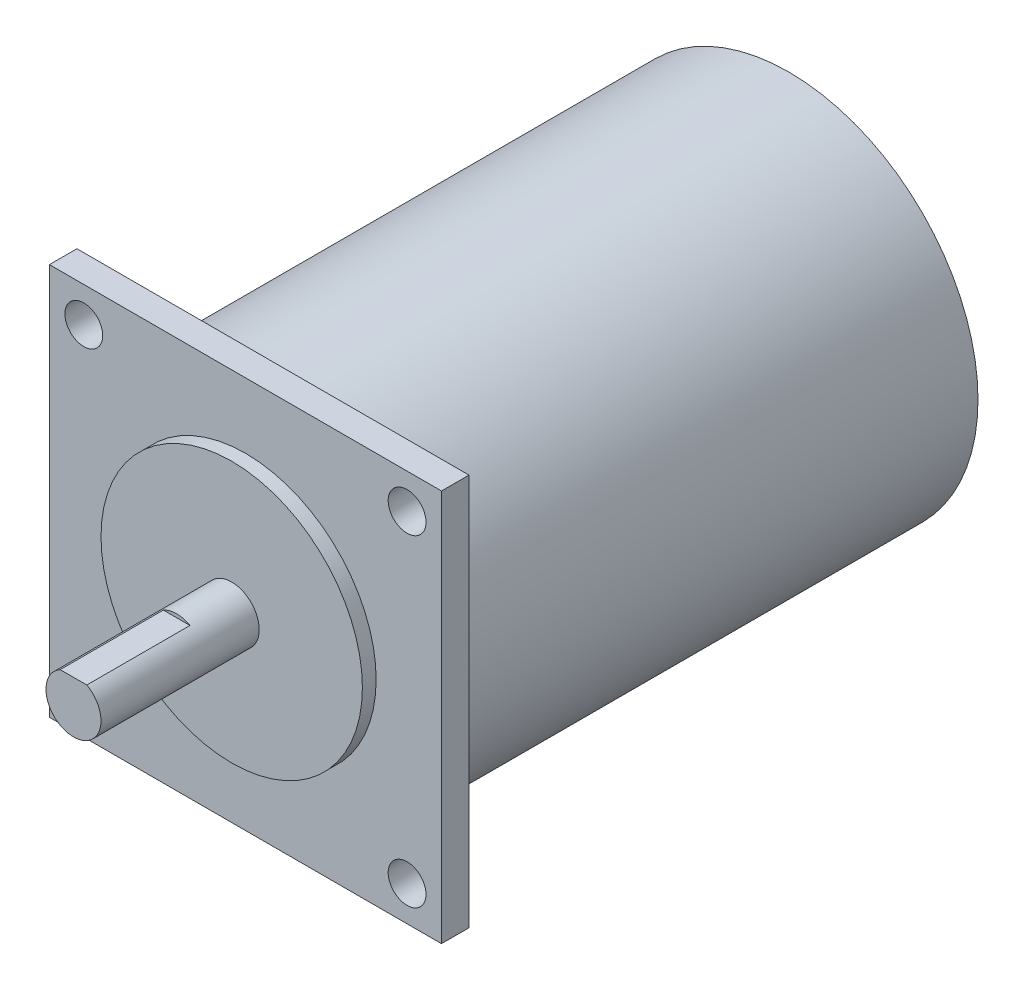
ISO-10303-21;
HEADER;
FILE_DESCRIPTION(('STEP AP214'),'2;1');
FILE_NAME('part.step','',(''),(''),'','','');
FILE_SCHEMA(('AUTOMOTIVE_DESIGN { 1 0 10303 214 1 1 1 1 }'));
ENDSEC;
DATA;
#1=APPLICATION_CONTEXT('core data for automotive mechanical design processes');
#2=APPLICATION_PROTOCOL_DEFINITION('international standard','automotive_design',2000,#1);
#3=PRODUCT_CONTEXT('',#1,'mechanical');
#4=PRODUCT('Part','Part','',(#3));
#5=PRODUCT_RELATED_PRODUCT_CATEGORY('part','',(#4));
#6=PRODUCT_DEFINITION_FORMATION('','',#4);
#7=PRODUCT_DEFINITION_CONTEXT('part definition',#1,'design');
#8=PRODUCT_DEFINITION('design','',#6,#7);
#9=PRODUCT_DEFINITION_SHAPE('','',#8);
#10=(LENGTH_UNIT() NAMED_UNIT(*) SI_UNIT(.MILLI.,.METRE.));
#11=(NAMED_UNIT(*) PLANE_ANGLE_UNIT() SI_UNIT($,.RADIAN.));
#12=(NAMED_UNIT(*) SI_UNIT($,.STERADIAN.) SOLID_ANGLE_UNIT());
#13=UNCERTAINTY_MEASURE_WITH_UNIT(LENGTH_MEASURE(1.E-05),#10,'distance_accuracy_value','');
#14=(GEOMETRIC_REPRESENTATION_CONTEXT(3) GLOBAL_UNCERTAINTY_ASSIGNED_CONTEXT((#13)) GLOBAL_UNIT_ASSIGNED_CONTEXT((#10,
#11,#12)) REPRESENTATION_CONTEXT('',''));
#15=CARTESIAN_POINT('',(0.,0.,0.));
#16=DIRECTION('',(0.,0.,1.));
#17=DIRECTION('',(1.,0.,0.));
#18=AXIS2_PLACEMENT_3D('',#15,#16,#17);
#19=CARTESIAN_POINT('',(0.,0.,4.));
#20=DIRECTION('',(0.,0.,1.));
#21=DIRECTION('',(1.,0.,0.));
#22=AXIS2_PLACEMENT_3D('',#19,#20,#21);
#23=PLANE('',#22);
#24=CARTESIAN_POINT('',(-6.1868327402135,8.31672597864768,4.));
#25=DIRECTION('',(0.,0.,1.));
#26=DIRECTION('',(1.,0.,0.));
#27=AXIS2_PLACEMENT_3D('',#24,#25,#26);
#28=CIRCLE('',#27,19.);
#29=CARTESIAN_POINT('',(12.8131672597865,8.31672597864768,4.));
#30=VERTEX_POINT('',#29);
#31=EDGE_CURVE('E111',#30,#30,#28,.T.);
#32=ORIENTED_EDGE('',*,*,#31,.F.);
#33=EDGE_LOOP('',(#32));
#34=FACE_BOUND('',#33,.T.);
#35=CARTESIAN_POINT('',(17.3131672597865,-15.1120996441281,4.));
#36=DIRECTION('',(0.,0.,1.));
#37=DIRECTION('',(1.,0.,0.));
#38=AXIS2_PLACEMENT_3D('',#35,#36,#37);
#39=CIRCLE('',#38,2.75);
#40=CARTESIAN_POINT('',(20.0631672597865,-15.1120996441281,4.));
#41=VERTEX_POINT('',#40);
#42=EDGE_CURVE('E133',#41,#41,#39,.T.);
#43=ORIENTED_EDGE('',*,*,#42,.F.);
#44=EDGE_LOOP('',(#43));
#45=FACE_BOUND('',#44,.T.);
#46=CARTESIAN_POINT('',(-29.6868327402135,31.7455516014235,4.));
#47=DIRECTION('',(0.,0.,1.));
#48=DIRECTION('',(1.,0.,0.));
#49=AXIS2_PLACEMENT_3D('',#46,#47,#48);
#50=CIRCLE('',#49,2.75);
#51=CARTESIAN_POINT('',(-26.9368327402135,31.7455516014235,4.));
#52=VERTEX_POINT('',#51);
#53=EDGE_CURVE('E145',#52,#52,#50,.T.);
#54=ORIENTED_EDGE('',*,*,#53,.F.);
#55=EDGE_LOOP('',(#54));
#56=FACE_BOUND('',#55,.T.);
#57=DIRECTION('',(0.,-1.,0.));
#58=VECTOR('',#57,1.);
#59=CARTESIAN_POINT('',(-34.6868327402135,36.8167259786477,4.));
#60=LINE('',#59,#58);
#61=CARTESIAN_POINT('',(-34.6868327402135,36.8167259786477,4.));
#62=VERTEX_POINT('',#61);
#63=CARTESIAN_POINT('',(-34.6868327402135,-20.1832740213523,4.));
#64=VERTEX_POINT('',#63);
#65=EDGE_CURVE('E151',#62,#64,#60,.T.);
#66=ORIENTED_EDGE('',*,*,#65,.T.);
#67=DIRECTION('',(1.,0.,0.));
#68=VECTOR('',#67,1.);
#69=CARTESIAN_POINT('',(-34.6868327402135,-20.1832740213523,4.));
#70=LINE('',#69,#68);
#71=CARTESIAN_POINT('',(22.3131672597865,-20.1832740213523,4.));
#72=VERTEX_POINT('',#71);
#73=EDGE_CURVE('E88',#64,#72,#70,.T.);
#74=ORIENTED_EDGE('',*,*,#73,.T.);
#75=DIRECTION('',(0.,1.,0.));
#76=VECTOR('',#75,1.);
#77=CARTESIAN_POINT('',(22.3131672597865,36.8167259786477,4.));
#78=LINE('',#77,#76);
#79=CARTESIAN_POINT('',(22.3131672597865,36.8167259786477,4.));
#80=VERTEX_POINT('',#79);
#81=EDGE_CURVE('E154',#72,#80,#78,.T.);
#82=ORIENTED_EDGE('',*,*,#81,.T.);
#83=DIRECTION('',(-1.,0.,0.));
#84=VECTOR('',#83,1.);
#85=CARTESIAN_POINT('',(-34.6868327402135,36.8167259786477,4.));
#86=LINE('',#85,#84);
#87=EDGE_CURVE('E59',#80,#62,#86,.T.);
#88=ORIENTED_EDGE('',*,*,#87,.T.);
#89=EDGE_LOOP('',(#66,#74,#82,#88));
#90=FACE_BOUND('',#89,.T.);
#91=CARTESIAN_POINT('',(17.3131672597865,31.7455516014235,4.));
#92=DIRECTION('',(0.,0.,1.));
#93=DIRECTION('',(-1.,0.,0.));
#94=AXIS2_PLACEMENT_3D('',#91,#92,#93);
#95=CIRCLE('',#94,2.75);
#96=CARTESIAN_POINT('',(14.5631672597865,31.7455516014235,4.));
#97=VERTEX_POINT('',#96);
#98=EDGE_CURVE('E139',#97,#97,#95,.T.);
#99=ORIENTED_EDGE('',*,*,#98,.F.);
#100=EDGE_LOOP('',(#99));
#101=FACE_BOUND('',#100,.T.);
#102=CARTESIAN_POINT('',(-29.6868327402135,-15.1120996441281,4.));
#103=DIRECTION('',(0.,0.,1.));
#104=DIRECTION('',(-1.,0.,0.));
#105=AXIS2_PLACEMENT_3D('',#102,#103,#104);
#106=CIRCLE('',#105,2.75);
#107=CARTESIAN_POINT('',(-32.4368327402135,-15.1120996441281,4.));
#108=VERTEX_POINT('',#107);
#109=EDGE_CURVE('E127',#108,#108,#106,.T.);
#110=ORIENTED_EDGE('',*,*,#109,.F.);
#111=EDGE_LOOP('',(#110));
#112=FACE_BOUND('',#111,.T.);
#113=ADVANCED_FACE('F35',(#34,#45,#56,#90,#101,#112),#23,.T.);
#114=CARTESIAN_POINT('',(0.,0.,0.));
#115=DIRECTION('',(0.,0.,1.));
#116=DIRECTION('',(1.,0.,0.));
#117=AXIS2_PLACEMENT_3D('',#114,#115,#116);
#118=PLANE('',#117);
#119=CARTESIAN_POINT('',(-6.18683274021349,8.31672597864767,0.));
#120=DIRECTION('',(0.,0.,1.));
#121=DIRECTION('',(1.,0.,0.));
#122=AXIS2_PLACEMENT_3D('',#119,#120,#121);
#123=CIRCLE('',#122,27.5);
#124=CARTESIAN_POINT('',(21.3131672597865,8.31672597864767,0.));
#125=VERTEX_POINT('',#124);
#126=EDGE_CURVE('E103',#125,#125,#123,.F.);
#127=ORIENTED_EDGE('',*,*,#126,.F.);
#128=EDGE_LOOP('',(#127));
#129=FACE_BOUND('',#128,.T.);
#130=DIRECTION('',(0.,-1.,0.));
#131=VECTOR('',#130,1.);
#132=CARTESIAN_POINT('',(-34.6868327402135,36.8167259786477,0.));
#133=LINE('',#132,#131);
#134=CARTESIAN_POINT('',(-34.6868327402135,36.8167259786477,0.));
#135=VERTEX_POINT('',#134);
#136=CARTESIAN_POINT('',(-34.6868327402135,-20.1832740213523,0.));
#137=VERTEX_POINT('',#136);
#138=EDGE_CURVE('E148',#135,#137,#133,.T.);
#139=ORIENTED_EDGE('',*,*,#138,.F.);
#140=DIRECTION('',(-1.,0.,0.));
#141=VECTOR('',#140,1.);
#142=CARTESIAN_POINT('',(-34.6868327402135,36.8167259786477,0.));
#143=LINE('',#142,#141);
#144=CARTESIAN_POINT('',(22.3131672597865,36.8167259786477,0.));
#145=VERTEX_POINT('',#144);
#146=EDGE_CURVE('E80',#145,#135,#143,.T.);
#147=ORIENTED_EDGE('',*,*,#146,.F.);
#148=DIRECTION('',(0.,1.,0.));
#149=VECTOR('',#148,1.);
#150=CARTESIAN_POINT('',(22.3131672597865,36.8167259786477,0.));
#151=LINE('',#150,#149);
#152=CARTESIAN_POINT('',(22.3131672597865,-20.1832740213523,0.));
#153=VERTEX_POINT('',#152);
#154=EDGE_CURVE('E162',#153,#145,#151,.T.);
#155=ORIENTED_EDGE('',*,*,#154,.F.);
#156=DIRECTION('',(1.,0.,0.));
#157=VECTOR('',#156,1.);
#158=CARTESIAN_POINT('',(-34.6868327402135,-20.1832740213523,0.));
#159=LINE('',#158,#157);
#160=EDGE_CURVE('E160',#137,#153,#159,.T.);
#161=ORIENTED_EDGE('',*,*,#160,.F.);
#162=EDGE_LOOP('',(#139,#147,#155,#161));
#163=FACE_BOUND('',#162,.T.);
#164=CARTESIAN_POINT('',(-29.6868327402135,31.7455516014235,0.));
#165=DIRECTION('',(0.,0.,1.));
#166=DIRECTION('',(1.,0.,0.));
#167=AXIS2_PLACEMENT_3D('',#164,#165,#166);
#168=CIRCLE('',#167,2.75);
#169=CARTESIAN_POINT('',(-26.9368327402135,31.7455516014235,0.));
#170=VERTEX_POINT('',#169);
#171=EDGE_CURVE('E142',#170,#170,#168,.T.);
#172=ORIENTED_EDGE('',*,*,#171,.T.);
#173=EDGE_LOOP('',(#172));
#174=FACE_BOUND('',#173,.T.);
#175=CARTESIAN_POINT('',(17.3131672597865,31.7455516014235,0.));
#176=DIRECTION('',(0.,0.,1.));
#177=DIRECTION('',(-1.,0.,0.));
#178=AXIS2_PLACEMENT_3D('',#175,#176,#177);
#179=CIRCLE('',#178,2.75);
#180=CARTESIAN_POINT('',(14.5631672597865,31.7455516014235,0.));
#181=VERTEX_POINT('',#180);
#182=EDGE_CURVE('E136',#181,#181,#179,.T.);
#183=ORIENTED_EDGE('',*,*,#182,.T.);
#184=EDGE_LOOP('',(#183));
#185=FACE_BOUND('',#184,.T.);
#186=CARTESIAN_POINT('',(17.3131672597865,-15.1120996441281,0.));
#187=DIRECTION('',(0.,0.,1.));
#188=DIRECTION('',(1.,0.,0.));
#189=AXIS2_PLACEMENT_3D('',#186,#187,#188);
#190=CIRCLE('',#189,2.75);
#191=CARTESIAN_POINT('',(20.0631672597865,-15.1120996441281,0.));
#192=VERTEX_POINT('',#191);
#193=EDGE_CURVE('E130',#192,#192,#190,.T.);
#194=ORIENTED_EDGE('',*,*,#193,.T.);
#195=EDGE_LOOP('',(#194));
#196=FACE_BOUND('',#195,.T.);
#197=CARTESIAN_POINT('',(-29.6868327402135,-15.1120996441281,0.));
#198=DIRECTION('',(0.,0.,1.));
#199=DIRECTION('',(-1.,0.,0.));
#200=AXIS2_PLACEMENT_3D('',#197,#198,#199);
#201=CIRCLE('',#200,2.75);
#202=CARTESIAN_POINT('',(-32.4368327402135,-15.1120996441281,0.));
#203=VERTEX_POINT('',#202);
#204=EDGE_CURVE('E126',#203,#203,#201,.T.);
#205=ORIENTED_EDGE('',*,*,#204,.T.);
#206=EDGE_LOOP('',(#205));
#207=FACE_BOUND('',#206,.T.);
#208=ADVANCED_FACE('F178',(#129,#163,#174,#185,#196,#207),#118,.F.);
#209=CARTESIAN_POINT('',(-34.6868327402135,36.8167259786477,4.));
#210=DIRECTION('',(1.,0.,0.));
#211=DIRECTION('',(0.,1.,0.));
#212=AXIS2_PLACEMENT_3D('',#209,#210,#211);
#213=PLANE('',#212);
#214=ORIENTED_EDGE('',*,*,#138,.T.);
#215=DIRECTION('',(0.,0.,-1.));
#216=VECTOR('',#215,1.);
#217=CARTESIAN_POINT('',(-34.6868327402135,-20.1832740213523,4.));
#218=LINE('',#217,#216);
#219=EDGE_CURVE('E171',#64,#137,#218,.T.);
#220=ORIENTED_EDGE('',*,*,#219,.F.);
#221=ORIENTED_EDGE('',*,*,#65,.F.);
#222=DIRECTION('',(0.,0.,-1.));
#223=VECTOR('',#222,1.);
#224=CARTESIAN_POINT('',(-34.6868327402135,36.8167259786477,4.));
#225=LINE('',#224,#223);
#226=EDGE_CURVE('E157',#62,#135,#225,.T.);
#227=ORIENTED_EDGE('',*,*,#226,.T.);
#228=EDGE_LOOP('',(#214,#220,#221,#227));
#229=FACE_BOUND('',#228,.T.);
#230=ADVANCED_FACE('F37',(#229),#213,.F.);
#231=CARTESIAN_POINT('',(-34.6868327402135,-20.1832740213523,4.));
#232=DIRECTION('',(0.,1.,0.));
#233=DIRECTION('',(0.,0.,1.));
#234=AXIS2_PLACEMENT_3D('',#231,#232,#233);
#235=PLANE('',#234);
#236=ORIENTED_EDGE('',*,*,#160,.T.);
#237=DIRECTION('',(0.,0.,-1.));
#238=VECTOR('',#237,1.);
#239=CARTESIAN_POINT('',(22.3131672597865,-20.1832740213523,4.));
#240=LINE('',#239,#238);
#241=EDGE_CURVE('E168',#72,#153,#240,.T.);
#242=ORIENTED_EDGE('',*,*,#241,.F.);
#243=ORIENTED_EDGE('',*,*,#73,.F.);
#244=ORIENTED_EDGE('',*,*,#219,.T.);
#245=EDGE_LOOP('',(#236,#242,#243,#244));
#246=FACE_BOUND('',#245,.T.);
#247=ADVANCED_FACE('F223',(#246),#235,.F.);
#248=CARTESIAN_POINT('',(22.3131672597865,36.8167259786477,4.));
#249=DIRECTION('',(-1.,0.,0.));
#250=DIRECTION('',(0.,-1.,0.));
#251=AXIS2_PLACEMENT_3D('',#248,#249,#250);
#252=PLANE('',#251);
#253=ORIENTED_EDGE('',*,*,#154,.T.);
#254=DIRECTION('',(0.,0.,-1.));
#255=VECTOR('',#254,1.);
#256=CARTESIAN_POINT('',(22.3131672597865,36.8167259786477,4.));
#257=LINE('',#256,#255);
#258=EDGE_CURVE('E166',#80,#145,#257,.T.);
#259=ORIENTED_EDGE('',*,*,#258,.F.);
#260=ORIENTED_EDGE('',*,*,#81,.F.);
#261=ORIENTED_EDGE('',*,*,#241,.T.);
#262=EDGE_LOOP('',(#253,#259,#260,#261));
#263=FACE_BOUND('',#262,.T.);
#264=ADVANCED_FACE('F221',(#263),#252,.F.);
#265=CARTESIAN_POINT('',(-34.6868327402135,36.8167259786477,4.));
#266=DIRECTION('',(0.,-1.,0.));
#267=DIRECTION('',(0.,0.,-1.));
#268=AXIS2_PLACEMENT_3D('',#265,#266,#267);
#269=PLANE('',#268);
#270=ORIENTED_EDGE('',*,*,#146,.T.);
#271=ORIENTED_EDGE('',*,*,#226,.F.);
#272=ORIENTED_EDGE('',*,*,#87,.F.);
#273=ORIENTED_EDGE('',*,*,#258,.T.);
#274=EDGE_LOOP('',(#270,#271,#272,#273));
#275=FACE_BOUND('',#274,.T.);
#276=ADVANCED_FACE('F218',(#275),#269,.F.);
#277=CARTESIAN_POINT('',(-29.6868327402135,31.7455516014235,4.));
#278=DIRECTION('',(0.,0.,-1.));
#279=DIRECTION('',(-1.,0.,0.));
#280=AXIS2_PLACEMENT_3D('',#277,#278,#279);
#281=CYLINDRICAL_SURFACE('',#280,2.75);
#282=ORIENTED_EDGE('',*,*,#53,.T.);
#283=EDGE_LOOP('',(#282));
#284=FACE_BOUND('',#283,.T.);
#285=ORIENTED_EDGE('',*,*,#171,.F.);
#286=EDGE_LOOP('',(#285));
#287=FACE_BOUND('',#286,.T.);
#288=ADVANCED_FACE('F215',(#284,#287),#281,.F.);
#289=CARTESIAN_POINT('',(17.3131672597865,31.7455516014235,4.));
#290=DIRECTION('',(0.,0.,-1.));
#291=DIRECTION('',(-1.,0.,0.));
#292=AXIS2_PLACEMENT_3D('',#289,#290,#291);
#293=CYLINDRICAL_SURFACE('',#292,2.75);
#294=ORIENTED_EDGE('',*,*,#98,.T.);
#295=EDGE_LOOP('',(#294));
#296=FACE_BOUND('',#295,.T.);
#297=ORIENTED_EDGE('',*,*,#182,.F.);
#298=EDGE_LOOP('',(#297));
#299=FACE_BOUND('',#298,.T.);
#300=ADVANCED_FACE('F204',(#296,#299),#293,.F.);
#301=CARTESIAN_POINT('',(17.3131672597865,-15.1120996441281,4.));
#302=DIRECTION('',(0.,0.,-1.));
#303=DIRECTION('',(-1.,0.,0.));
#304=AXIS2_PLACEMENT_3D('',#301,#302,#303);
#305=CYLINDRICAL_SURFACE('',#304,2.75);
#306=ORIENTED_EDGE('',*,*,#42,.T.);
#307=EDGE_LOOP('',(#306));
#308=FACE_BOUND('',#307,.T.);
#309=ORIENTED_EDGE('',*,*,#193,.F.);
#310=EDGE_LOOP('',(#309));
#311=FACE_BOUND('',#310,.T.);
#312=ADVANCED_FACE('F194',(#308,#311),#305,.F.);
#313=CARTESIAN_POINT('',(-29.6868327402135,-15.1120996441281,4.));
#314=DIRECTION('',(0.,0.,-1.));
#315=DIRECTION('',(-1.,0.,0.));
#316=AXIS2_PLACEMENT_3D('',#313,#314,#315);
#317=CYLINDRICAL_SURFACE('',#316,2.75);
#318=ORIENTED_EDGE('',*,*,#109,.T.);
#319=EDGE_LOOP('',(#318));
#320=FACE_BOUND('',#319,.T.);
#321=ORIENTED_EDGE('',*,*,#204,.F.);
#322=EDGE_LOOP('',(#321));
#323=FACE_BOUND('',#322,.T.);
#324=ADVANCED_FACE('F192',(#320,#323),#317,.F.);
#325=CARTESIAN_POINT('',(-6.18683274021349,8.31672597864767,-75.));
#326=DIRECTION('',(0.,0.,1.));
#327=DIRECTION('',(1.,0.,0.));
#328=AXIS2_PLACEMENT_3D('',#325,#326,#327);
#329=CYLINDRICAL_SURFACE('',#328,27.5);
#330=CARTESIAN_POINT('',(-6.18683274021349,8.31672597864767,-75.));
#331=DIRECTION('',(0.,0.,-1.));
#332=DIRECTION('',(-1.,0.,0.));
#333=AXIS2_PLACEMENT_3D('',#330,#331,#332);
#334=CIRCLE('',#333,27.5);
#335=CARTESIAN_POINT('',(-33.6868327402135,8.31672597864767,-75.));
#336=VERTEX_POINT('',#335);
#337=EDGE_CURVE('E122',#336,#336,#334,.T.);
#338=ORIENTED_EDGE('',*,*,#337,.F.);
#339=EDGE_LOOP('',(#338));
#340=FACE_BOUND('',#339,.T.);
#341=ORIENTED_EDGE('',*,*,#126,.T.);
#342=EDGE_LOOP('',(#341));
#343=FACE_BOUND('',#342,.T.);
#344=ADVANCED_FACE('F176',(#340,#343),#329,.T.);
#345=CARTESIAN_POINT('',(-6.18683274021349,8.31672597864767,-75.));
#346=DIRECTION('',(0.,0.,-1.));
#347=DIRECTION('',(-1.,0.,0.));
#348=AXIS2_PLACEMENT_3D('',#345,#346,#347);
#349=PLANE('',#348);
#350=ORIENTED_EDGE('',*,*,#337,.T.);
#351=EDGE_LOOP('',(#350));
#352=FACE_BOUND('',#351,.T.);
#353=ADVANCED_FACE('F201',(#352),#349,.T.);
#354=CARTESIAN_POINT('',(-6.1868327402135,8.31672597864768,6.));
#355=DIRECTION('',(0.,0.,-1.));
#356=DIRECTION('',(-1.,0.,0.));
#357=AXIS2_PLACEMENT_3D('',#354,#355,#356);
#358=CYLINDRICAL_SURFACE('',#357,19.);
#359=CARTESIAN_POINT('',(-6.1868327402135,8.31672597864768,6.));
#360=DIRECTION('',(0.,0.,1.));
#361=DIRECTION('',(1.,0.,0.));
#362=AXIS2_PLACEMENT_3D('',#359,#360,#361);
#363=CIRCLE('',#362,19.);
#364=CARTESIAN_POINT('',(12.8131672597865,8.31672597864768,6.));
#365=VERTEX_POINT('',#364);
#366=EDGE_CURVE('E115',#365,#365,#363,.T.);
#367=ORIENTED_EDGE('',*,*,#366,.F.);
#368=EDGE_LOOP('',(#367));
#369=FACE_BOUND('',#368,.T.);
#370=ORIENTED_EDGE('',*,*,#31,.T.);
#371=EDGE_LOOP('',(#370));
#372=FACE_BOUND('',#371,.T.);
#373=ADVANCED_FACE('F293',(#369,#372),#358,.T.);
#374=CARTESIAN_POINT('',(-6.1868327402135,8.31672597864768,6.));
#375=DIRECTION('',(0.,0.,1.));
#376=DIRECTION('',(1.,0.,0.));
#377=AXIS2_PLACEMENT_3D('',#374,#375,#376);
#378=PLANE('',#377);
#379=CARTESIAN_POINT('',(-6.1868327402135,8.10325499031657,6.));
#380=DIRECTION('',(0.,0.,1.));
#381=DIRECTION('',(1.,0.,0.));
#382=AXIS2_PLACEMENT_3D('',#379,#380,#381);
#383=CIRCLE('',#382,4.);
#384=CARTESIAN_POINT('',(-2.1868327402135,8.10325499031657,6.));
#385=VERTEX_POINT('',#384);
#386=EDGE_CURVE('E112',#385,#385,#383,.T.);
#387=ORIENTED_EDGE('',*,*,#386,.F.);
#388=EDGE_LOOP('',(#387));
#389=FACE_BOUND('',#388,.T.);
#390=ORIENTED_EDGE('',*,*,#366,.T.);
#391=EDGE_LOOP('',(#390));
#392=FACE_BOUND('',#391,.T.);
#393=ADVANCED_FACE('F307',(#389,#392),#378,.T.);
#394=CARTESIAN_POINT('',(-6.1868327402135,8.10325499031657,29.));
#395=DIRECTION('',(0.,0.,-1.));
#396=DIRECTION('',(-1.,0.,0.));
#397=AXIS2_PLACEMENT_3D('',#394,#395,#396);
#398=CYLINDRICAL_SURFACE('',#397,4.);
#399=CARTESIAN_POINT('',(-6.1868327402135,8.10325499031657,29.));
#400=DIRECTION('',(0.,0.,1.));
#401=DIRECTION('',(1.,0.,0.));
#402=AXIS2_PLACEMENT_3D('',#399,#400,#401);
#403=CIRCLE('',#402,4.);
#404=CARTESIAN_POINT('',(-8.12332441331721,11.6032549903166,29.));
#405=VERTEX_POINT('',#404);
#406=CARTESIAN_POINT('',(-4.25034106710978,11.6032549903166,29.));
#407=VERTEX_POINT('',#406);
#408=EDGE_CURVE('E107',#405,#407,#403,.T.);
#409=ORIENTED_EDGE('',*,*,#408,.F.);
#410=DIRECTION('',(0.,0.,-1.));
#411=VECTOR('',#410,1.);
#412=CARTESIAN_POINT('',(-8.12332441331721,11.6032549903166,29.));
#413=LINE('',#412,#411);
#414=CARTESIAN_POINT('',(-8.12332441331721,11.6032549903166,14.));
#415=VERTEX_POINT('',#414);
#416=EDGE_CURVE('E50',#405,#415,#413,.T.);
#417=ORIENTED_EDGE('',*,*,#416,.T.);
#418=CARTESIAN_POINT('',(-6.1868327402135,8.10325499031657,14.));
#419=DIRECTION('',(0.,0.,-1.));
#420=DIRECTION('',(-1.,0.,0.));
#421=AXIS2_PLACEMENT_3D('',#418,#419,#420);
#422=CIRCLE('',#421,4.);
#423=CARTESIAN_POINT('',(-4.25034106710978,11.6032549903166,14.));
#424=VERTEX_POINT('',#423);
#425=EDGE_CURVE('E11',#415,#424,#422,.T.);
#426=ORIENTED_EDGE('',*,*,#425,.T.);
#427=DIRECTION('',(0.,0.,-1.));
#428=VECTOR('',#427,1.);
#429=CARTESIAN_POINT('',(-4.25034106710978,11.6032549903166,29.));
#430=LINE('',#429,#428);
#431=EDGE_CURVE('E98',#424,#407,#430,.F.);
#432=ORIENTED_EDGE('',*,*,#431,.T.);
#433=EDGE_LOOP('',(#409,#417,#426,#432));
#434=FACE_BOUND('',#433,.T.);
#435=ORIENTED_EDGE('',*,*,#386,.T.);
#436=EDGE_LOOP('',(#435));
#437=FACE_BOUND('',#436,.T.);
#438=ADVANCED_FACE('F105',(#434,#437),#398,.T.);
#439=CARTESIAN_POINT('',(-6.1868327402135,8.10325499031657,29.));
#440=DIRECTION('',(0.,0.,1.));
#441=DIRECTION('',(1.,0.,0.));
#442=AXIS2_PLACEMENT_3D('',#439,#440,#441);
#443=PLANE('',#442);
#444=DIRECTION('',(1.,0.,0.));
#445=VECTOR('',#444,1.);
#446=CARTESIAN_POINT('',(-6.1868327402135,11.6032549903166,29.));
#447=LINE('',#446,#445);
#448=EDGE_CURVE('E43',#405,#407,#447,.T.);
#449=ORIENTED_EDGE('',*,*,#448,.F.);
#450=ORIENTED_EDGE('',*,*,#408,.T.);
#451=EDGE_LOOP('',(#449,#450));
#452=FACE_BOUND('',#451,.T.);
#453=ADVANCED_FACE('F110',(#452),#443,.T.);
#454=CARTESIAN_POINT('',(-25.1868327402135,11.6032549903166,14.));
#455=DIRECTION('',(0.,0.,-1.));
#456=DIRECTION('',(-1.,0.,0.));
#457=AXIS2_PLACEMENT_3D('',#454,#455,#456);
#458=PLANE('',#457);
#459=DIRECTION('',(1.,0.,0.));
#460=VECTOR('',#459,1.);
#461=CARTESIAN_POINT('',(-25.1868327402135,11.6032549903166,14.));
#462=LINE('',#461,#460);
#463=EDGE_CURVE('E108',#415,#424,#462,.T.);
#464=ORIENTED_EDGE('',*,*,#463,.T.);
#465=ORIENTED_EDGE('',*,*,#425,.F.);
#466=EDGE_LOOP('',(#464,#465));
#467=FACE_BOUND('',#466,.T.);
#468=ADVANCED_FACE('F334',(#467),#458,.F.);
#469=CARTESIAN_POINT('',(-25.1868327402135,11.6032549903166,29.));
#470=DIRECTION('',(0.,-1.,0.));
#471=DIRECTION('',(1.,0.,0.));
#472=AXIS2_PLACEMENT_3D('',#469,#470,#471);
#473=PLANE('',#472);
#474=ORIENTED_EDGE('',*,*,#448,.T.);
#475=ORIENTED_EDGE('',*,*,#431,.F.);
#476=ORIENTED_EDGE('',*,*,#463,.F.);
#477=ORIENTED_EDGE('',*,*,#416,.F.);
#478=EDGE_LOOP('',(#474,#475,#476,#477));
#479=FACE_BOUND('',#478,.T.);
#480=ADVANCED_FACE('F97',(#479),#473,.F.);
#481=CLOSED_SHELL('',(#113,#208,#230,#247,#264,#276,#288,#300,#312,#324,#344,#353,#373,#393,
#438,#453,#468,#480));
#482=MANIFOLD_SOLID_BREP('B2',#481);
#483=ADVANCED_BREP_SHAPE_REPRESENTATION('',(#18,#482),#14);
#484=SHAPE_DEFINITION_REPRESENTATION(#9,#483);
ENDSEC;
END-ISO-10303-21;
